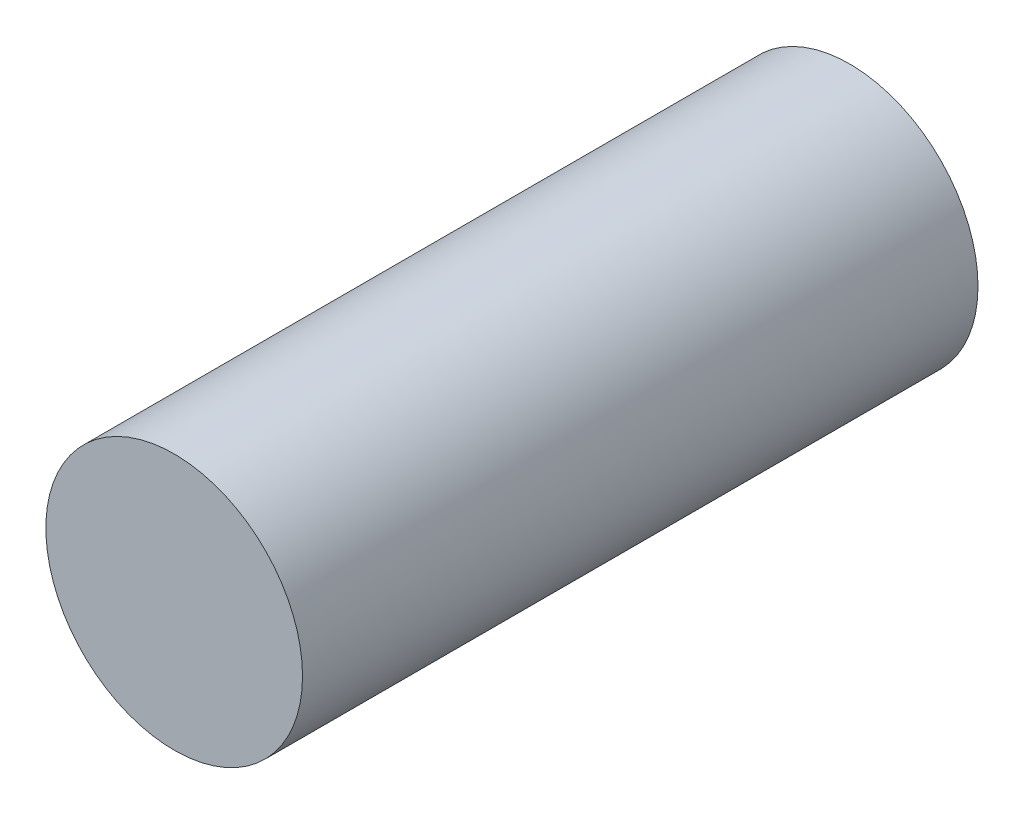
ISO-10303-21;
HEADER;
FILE_DESCRIPTION(('STEP AP214'),'2;1');
FILE_NAME('part.step','',(''),(''),'','','');
FILE_SCHEMA(('AUTOMOTIVE_DESIGN { 1 0 10303 214 1 1 1 1 }'));
ENDSEC;
DATA;
#1=APPLICATION_CONTEXT('core data for automotive mechanical design processes');
#2=APPLICATION_PROTOCOL_DEFINITION('international standard','automotive_design',2000,#1);
#3=PRODUCT_CONTEXT('',#1,'mechanical');
#4=PRODUCT('Part','Part','',(#3));
#5=PRODUCT_RELATED_PRODUCT_CATEGORY('part','',(#4));
#6=PRODUCT_DEFINITION_FORMATION('','',#4);
#7=PRODUCT_DEFINITION_CONTEXT('part definition',#1,'design');
#8=PRODUCT_DEFINITION('design','',#6,#7);
#9=PRODUCT_DEFINITION_SHAPE('','',#8);
#10=(LENGTH_UNIT() NAMED_UNIT(*) SI_UNIT(.MILLI.,.METRE.));
#11=(NAMED_UNIT(*) PLANE_ANGLE_UNIT() SI_UNIT($,.RADIAN.));
#12=(NAMED_UNIT(*) SI_UNIT($,.STERADIAN.) SOLID_ANGLE_UNIT());
#13=UNCERTAINTY_MEASURE_WITH_UNIT(LENGTH_MEASURE(1.E-05),#10,'distance_accuracy_value','');
#14=(GEOMETRIC_REPRESENTATION_CONTEXT(3) GLOBAL_UNCERTAINTY_ASSIGNED_CONTEXT((#13)) GLOBAL_UNIT_ASSIGNED_CONTEXT((#10,
#11,#12)) REPRESENTATION_CONTEXT('',''));
#15=CARTESIAN_POINT('',(0.,0.,0.));
#16=DIRECTION('',(0.,0.,1.));
#17=DIRECTION('',(1.,0.,0.));
#18=AXIS2_PLACEMENT_3D('',#15,#16,#17);
#19=CARTESIAN_POINT('',(0.,0.,10.));
#20=DIRECTION('',(0.,0.,-1.));
#21=DIRECTION('',(-1.,0.,0.));
#22=AXIS2_PLACEMENT_3D('',#19,#20,#21);
#23=CYLINDRICAL_SURFACE('',#22,1.9);
#24=CARTESIAN_POINT('',(0.,0.,10.));
#25=DIRECTION('',(0.,0.,1.));
#26=DIRECTION('',(1.,0.,0.));
#27=AXIS2_PLACEMENT_3D('',#24,#25,#26);
#28=CIRCLE('',#27,1.9);
#29=CARTESIAN_POINT('',(1.9,0.,10.));
#30=VERTEX_POINT('',#29);
#31=EDGE_CURVE('E10',#30,#30,#28,.T.);
#32=ORIENTED_EDGE('',*,*,#31,.F.);
#33=EDGE_LOOP('',(#32));
#34=FACE_BOUND('',#33,.T.);
#35=CARTESIAN_POINT('',(0.,0.,0.));
#36=DIRECTION('',(0.,0.,1.));
#37=DIRECTION('',(1.,0.,0.));
#38=AXIS2_PLACEMENT_3D('',#35,#36,#37);
#39=CIRCLE('',#38,1.9);
#40=CARTESIAN_POINT('',(1.9,0.,0.));
#41=VERTEX_POINT('',#40);
#42=EDGE_CURVE('E46',#41,#41,#39,.T.);
#43=ORIENTED_EDGE('',*,*,#42,.T.);
#44=EDGE_LOOP('',(#43));
#45=FACE_BOUND('',#44,.T.);
#46=ADVANCED_FACE('F43',(#34,#45),#23,.T.);
#47=CARTESIAN_POINT('',(0.,0.,10.));
#48=DIRECTION('',(0.,0.,1.));
#49=DIRECTION('',(1.,0.,0.));
#50=AXIS2_PLACEMENT_3D('',#47,#48,#49);
#51=PLANE('',#50);
#52=ORIENTED_EDGE('',*,*,#31,.T.);
#53=EDGE_LOOP('',(#52));
#54=FACE_BOUND('',#53,.T.);
#55=ADVANCED_FACE('F60',(#54),#51,.T.);
#56=CARTESIAN_POINT('',(0.,0.,0.));
#57=DIRECTION('',(0.,0.,1.));
#58=DIRECTION('',(1.,0.,0.));
#59=AXIS2_PLACEMENT_3D('',#56,#57,#58);
#60=PLANE('',#59);
#61=ORIENTED_EDGE('',*,*,#42,.F.);
#62=EDGE_LOOP('',(#61));
#63=FACE_BOUND('',#62,.T.);
#64=ADVANCED_FACE('F58',(#63),#60,.F.);
#65=CLOSED_SHELL('',(#46,#55,#64));
#66=MANIFOLD_SOLID_BREP('B2',#65);
#67=ADVANCED_BREP_SHAPE_REPRESENTATION('',(#18,#66),#14);
#68=SHAPE_DEFINITION_REPRESENTATION(#9,#67);
ENDSEC;
END-ISO-10303-21;
